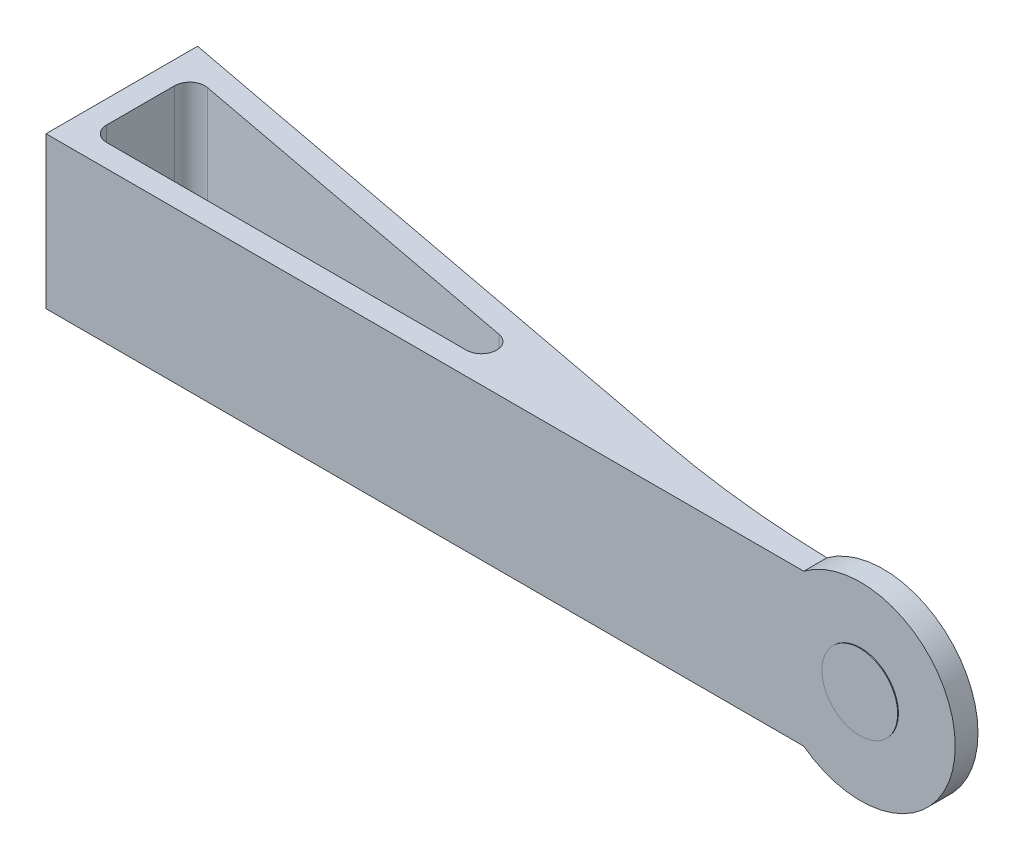
ISO-10303-21;
HEADER;
FILE_DESCRIPTION(('STEP AP214'),'2;1');
FILE_NAME('part.step','',(''),(''),'','','');
FILE_SCHEMA(('AUTOMOTIVE_DESIGN { 1 0 10303 214 1 1 1 1 }'));
ENDSEC;
DATA;
#1=APPLICATION_CONTEXT('core data for automotive mechanical design processes');
#2=APPLICATION_PROTOCOL_DEFINITION('international standard','automotive_design',2000,#1);
#3=PRODUCT_CONTEXT('',#1,'mechanical');
#4=PRODUCT('Part','Part','',(#3));
#5=PRODUCT_RELATED_PRODUCT_CATEGORY('part','',(#4));
#6=PRODUCT_DEFINITION_FORMATION('','',#4);
#7=PRODUCT_DEFINITION_CONTEXT('part definition',#1,'design');
#8=PRODUCT_DEFINITION('design','',#6,#7);
#9=PRODUCT_DEFINITION_SHAPE('','',#8);
#10=(LENGTH_UNIT() NAMED_UNIT(*) SI_UNIT(.MILLI.,.METRE.));
#11=(NAMED_UNIT(*) PLANE_ANGLE_UNIT() SI_UNIT($,.RADIAN.));
#12=(NAMED_UNIT(*) SI_UNIT($,.STERADIAN.) SOLID_ANGLE_UNIT());
#13=UNCERTAINTY_MEASURE_WITH_UNIT(LENGTH_MEASURE(1.E-05),#10,'distance_accuracy_value','');
#14=(GEOMETRIC_REPRESENTATION_CONTEXT(3) GLOBAL_UNCERTAINTY_ASSIGNED_CONTEXT((#13)) GLOBAL_UNIT_ASSIGNED_CONTEXT((#10,
#11,#12)) REPRESENTATION_CONTEXT('',''));
#15=CARTESIAN_POINT('',(0.,0.,0.));
#16=DIRECTION('',(0.,0.,1.));
#17=DIRECTION('',(1.,0.,0.));
#18=AXIS2_PLACEMENT_3D('',#15,#16,#17);
#19=CARTESIAN_POINT('',(0.,20.,2.09488880330588E-13));
#20=DIRECTION('',(0.,-1.,0.));
#21=DIRECTION('',(-1.,0.,0.));
#22=AXIS2_PLACEMENT_3D('',#19,#20,#21);
#23=PLANE('',#22);
#24=DIRECTION('',(1.,0.,0.));
#25=VECTOR('',#24,1.);
#26=CARTESIAN_POINT('',(115.,20.,2.0642726333272E-13));
#27=LINE('',#26,#25);
#28=CARTESIAN_POINT('',(0.,20.,2.09488880330588E-13));
#29=VERTEX_POINT('',#28);
#30=CARTESIAN_POINT('',(100.,20.,2.09688551004362E-13));
#31=VERTEX_POINT('',#30);
#32=EDGE_CURVE('E158',#29,#31,#27,.T.);
#33=ORIENTED_EDGE('',*,*,#32,.T.);
#34=DIRECTION('',(0.,0.,-1.));
#35=VECTOR('',#34,1.);
#36=CARTESIAN_POINT('',(100.,19.9999999999996,35.3553390593276));
#37=LINE('',#36,#35);
#38=CARTESIAN_POINT('',(100.,20.,-3.0544828167915));
#39=VERTEX_POINT('',#38);
#40=EDGE_CURVE('E305',#31,#39,#37,.T.);
#41=ORIENTED_EDGE('',*,*,#40,.T.);
#42=CARTESIAN_POINT('',(104.042508708734,20.0000000000016,-153.));
#43=DIRECTION('',(0.,-1.,0.));
#44=DIRECTION('',(-1.,0.,0.));
#45=AXIS2_PLACEMENT_3D('',#42,#43,#44);
#46=CIRCLE('',#45,150.);
#47=CARTESIAN_POINT('',(76.2014924950224,20.0000000000001,-5.60638475094001));
#48=VERTEX_POINT('',#47);
#49=EDGE_CURVE('E153',#39,#48,#46,.T.);
#50=ORIENTED_EDGE('',*,*,#49,.T.);
#51=DIRECTION('',(-0.982624101660399,0.,-0.185606774758075));
#52=VECTOR('',#51,1.);
#53=CARTESIAN_POINT('',(0.,20.0000000000002,-19.9999999999998));
#54=LINE('',#53,#52);
#55=CARTESIAN_POINT('',(0.,20.0000000000002,-19.9999999999998));
#56=VERTEX_POINT('',#55);
#57=EDGE_CURVE('E143',#48,#56,#54,.T.);
#58=ORIENTED_EDGE('',*,*,#57,.T.);
#59=DIRECTION('',(0.,0.,1.));
#60=VECTOR('',#59,1.);
#61=CARTESIAN_POINT('',(0.,20.,2.09488880330588E-13));
#62=LINE('',#61,#60);
#63=EDGE_CURVE('E146',#56,#29,#62,.T.);
#64=ORIENTED_EDGE('',*,*,#63,.T.);
#65=EDGE_LOOP('',(#33,#41,#50,#58,#64));
#66=FACE_BOUND('',#65,.T.);
#67=DIRECTION('',(-0.982624101660399,0.,-0.185606774758075));
#68=VECTOR('',#67,1.);
#69=CARTESIAN_POINT('',(3.,20.0000000000002,-16.380283855989));
#70=LINE('',#69,#68);
#71=CARTESIAN_POINT('',(52.8443063964799,20.0000000000001,-6.96524820332058));
#72=VERTEX_POINT('',#71);
#73=CARTESIAN_POINT('',(5.37121354951615,20.0000000000002,-15.9323879633026));
#74=VERTEX_POINT('',#73);
#75=EDGE_CURVE('E306',#72,#74,#70,.T.);
#76=ORIENTED_EDGE('',*,*,#75,.F.);
#77=CARTESIAN_POINT('',(52.4730928469638,20.0000000000001,-4.99999999999979));
#78=DIRECTION('',(0.,-1.,0.));
#79=DIRECTION('',(-1.,0.,0.));
#80=AXIS2_PLACEMENT_3D('',#77,#78,#79);
#81=CIRCLE('',#80,2.);
#82=CARTESIAN_POINT('',(52.4730928469638,20.,-2.99999999999979));
#83=VERTEX_POINT('',#82);
#84=EDGE_CURVE('E12',#72,#83,#81,.T.);
#85=ORIENTED_EDGE('',*,*,#84,.T.);
#86=DIRECTION('',(1.,0.,0.));
#87=VECTOR('',#86,1.);
#88=CARTESIAN_POINT('',(73.8367968846488,20.,-2.99999999999979));
#89=LINE('',#88,#87);
#90=CARTESIAN_POINT('',(5.,20.,-2.99999999999979));
#91=VERTEX_POINT('',#90);
#92=EDGE_CURVE('E185',#91,#83,#89,.T.);
#93=ORIENTED_EDGE('',*,*,#92,.F.);
#94=CARTESIAN_POINT('',(5.,20.0000000000001,-4.99999999999978));
#95=DIRECTION('',(0.,-1.,0.));
#96=DIRECTION('',(-1.,0.,0.));
#97=AXIS2_PLACEMENT_3D('',#94,#95,#96);
#98=CIRCLE('',#97,2.);
#99=CARTESIAN_POINT('',(3.,20.0000000000001,-4.99999999999978));
#100=VERTEX_POINT('',#99);
#101=EDGE_CURVE('E360',#91,#100,#98,.T.);
#102=ORIENTED_EDGE('',*,*,#101,.T.);
#103=DIRECTION('',(0.,0.,1.));
#104=VECTOR('',#103,1.);
#105=CARTESIAN_POINT('',(3.,20.,-2.99999999999979));
#106=LINE('',#105,#104);
#107=CARTESIAN_POINT('',(3.,20.0000000000001,-13.9671397599818));
#108=VERTEX_POINT('',#107);
#109=EDGE_CURVE('E307',#108,#100,#106,.T.);
#110=ORIENTED_EDGE('',*,*,#109,.F.);
#111=CARTESIAN_POINT('',(5.,20.0000000000001,-13.9671397599818));
#112=DIRECTION('',(0.,-1.,0.));
#113=DIRECTION('',(-1.,0.,0.));
#114=AXIS2_PLACEMENT_3D('',#111,#112,#113);
#115=CIRCLE('',#114,2.);
#116=EDGE_CURVE('E62',#108,#74,#115,.T.);
#117=ORIENTED_EDGE('',*,*,#116,.T.);
#118=EDGE_LOOP('',(#76,#85,#93,#102,#110,#117));
#119=FACE_BOUND('',#118,.T.);
#120=ADVANCED_FACE('F47',(#66,#119),#23,.F.);
#121=CARTESIAN_POINT('',(0.,0.,0.));
#122=DIRECTION('',(0.,-1.,0.));
#123=DIRECTION('',(-1.,0.,0.));
#124=AXIS2_PLACEMENT_3D('',#121,#122,#123);
#125=PLANE('',#124);
#126=DIRECTION('',(0.,0.,-1.));
#127=VECTOR('',#126,1.);
#128=CARTESIAN_POINT('',(100.,-3.7032751966234E-13,35.3553390593274));
#129=LINE('',#128,#127);
#130=CARTESIAN_POINT('',(100.,0.,0.));
#131=VERTEX_POINT('',#130);
#132=CARTESIAN_POINT('',(100.,0.,-3.05448281679171));
#133=VERTEX_POINT('',#132);
#134=EDGE_CURVE('E296',#131,#133,#129,.T.);
#135=ORIENTED_EDGE('',*,*,#134,.F.);
#136=DIRECTION('',(1.,0.,0.));
#137=VECTOR('',#136,1.);
#138=CARTESIAN_POINT('',(115.,0.,0.));
#139=LINE('',#138,#137);
#140=CARTESIAN_POINT('',(0.,0.,0.));
#141=VERTEX_POINT('',#140);
#142=EDGE_CURVE('E178',#141,#131,#139,.T.);
#143=ORIENTED_EDGE('',*,*,#142,.F.);
#144=DIRECTION('',(0.,0.,1.));
#145=VECTOR('',#144,1.);
#146=CARTESIAN_POINT('',(0.,0.,0.));
#147=LINE('',#146,#145);
#148=CARTESIAN_POINT('',(0.,2.09488880330588E-13,-20.));
#149=VERTEX_POINT('',#148);
#150=EDGE_CURVE('E184',#149,#141,#147,.T.);
#151=ORIENTED_EDGE('',*,*,#150,.F.);
#152=DIRECTION('',(-0.982624101660399,0.,-0.185606774758075));
#153=VECTOR('',#152,1.);
#154=CARTESIAN_POINT('',(0.,2.09488880330588E-13,-20.));
#155=LINE('',#154,#153);
#156=CARTESIAN_POINT('',(76.2014924950224,0.,-5.60638475094022));
#157=VERTEX_POINT('',#156);
#158=EDGE_CURVE('E162',#157,#149,#155,.T.);
#159=ORIENTED_EDGE('',*,*,#158,.F.);
#160=CARTESIAN_POINT('',(104.042508708734,1.602589934529E-12,-153.));
#161=DIRECTION('',(0.,-1.,0.));
#162=DIRECTION('',(-1.,0.,0.));
#163=AXIS2_PLACEMENT_3D('',#160,#161,#162);
#164=CIRCLE('',#163,150.);
#165=EDGE_CURVE('E201',#157,#133,#164,.F.);
#166=ORIENTED_EDGE('',*,*,#165,.T.);
#167=EDGE_LOOP('',(#135,#143,#151,#159,#166));
#168=FACE_BOUND('',#167,.T.);
#169=DIRECTION('',(0.,0.,1.));
#170=VECTOR('',#169,1.);
#171=CARTESIAN_POINT('',(3.,0.,-2.99999999999999));
#172=LINE('',#171,#170);
#173=CARTESIAN_POINT('',(3.,1.46298023486974E-13,-13.967139759982));
#174=VERTEX_POINT('',#173);
#175=CARTESIAN_POINT('',(3.,0.,-4.99999999999999));
#176=VERTEX_POINT('',#175);
#177=EDGE_CURVE('E318',#174,#176,#172,.T.);
#178=ORIENTED_EDGE('',*,*,#177,.T.);
#179=CARTESIAN_POINT('',(5.,0.,-4.99999999999999));
#180=DIRECTION('',(0.,-1.,0.));
#181=DIRECTION('',(-1.,0.,0.));
#182=AXIS2_PLACEMENT_3D('',#179,#180,#181);
#183=CIRCLE('',#182,2.);
#184=CARTESIAN_POINT('',(5.,0.,-2.99999999999999));
#185=VERTEX_POINT('',#184);
#186=EDGE_CURVE('E358',#176,#185,#183,.F.);
#187=ORIENTED_EDGE('',*,*,#186,.T.);
#188=DIRECTION('',(1.,0.,0.));
#189=VECTOR('',#188,1.);
#190=CARTESIAN_POINT('',(73.8367968846488,0.,-3.));
#191=LINE('',#190,#189);
#192=CARTESIAN_POINT('',(52.4730928469638,0.,-3.));
#193=VERTEX_POINT('',#192);
#194=EDGE_CURVE('E309',#185,#193,#191,.T.);
#195=ORIENTED_EDGE('',*,*,#194,.T.);
#196=CARTESIAN_POINT('',(52.4730928469638,0.,-5.));
#197=DIRECTION('',(0.,-1.,0.));
#198=DIRECTION('',(-1.,0.,0.));
#199=AXIS2_PLACEMENT_3D('',#196,#197,#198);
#200=CIRCLE('',#199,2.);
#201=CARTESIAN_POINT('',(52.8443063964799,0.,-6.96524820332079));
#202=VERTEX_POINT('',#201);
#203=EDGE_CURVE('E59',#193,#202,#200,.F.);
#204=ORIENTED_EDGE('',*,*,#203,.T.);
#205=DIRECTION('',(-0.982624101660399,0.,-0.185606774758075));
#206=VECTOR('',#205,1.);
#207=CARTESIAN_POINT('',(3.,1.71574366224419E-13,-16.3802838559892));
#208=LINE('',#207,#206);
#209=CARTESIAN_POINT('',(5.37121354951615,1.66882905771242E-13,-15.9323879633028));
#210=VERTEX_POINT('',#209);
#211=EDGE_CURVE('E304',#202,#210,#208,.T.);
#212=ORIENTED_EDGE('',*,*,#211,.T.);
#213=CARTESIAN_POINT('',(5.,1.46298023486974E-13,-13.967139759982));
#214=DIRECTION('',(0.,-1.,0.));
#215=DIRECTION('',(-1.,0.,0.));
#216=AXIS2_PLACEMENT_3D('',#213,#214,#215);
#217=CIRCLE('',#216,2.);
#218=EDGE_CURVE('E365',#210,#174,#217,.F.);
#219=ORIENTED_EDGE('',*,*,#218,.T.);
#220=EDGE_LOOP('',(#178,#187,#195,#204,#212,#219));
#221=FACE_BOUND('',#220,.T.);
#222=ADVANCED_FACE('F258',(#168,#221),#125,.T.);
#223=CARTESIAN_POINT('',(115.,20.,2.0642726333272E-13));
#224=DIRECTION('',(0.,0.,-1.));
#225=DIRECTION('',(-1.,0.,0.));
#226=AXIS2_PLACEMENT_3D('',#223,#224,#225);
#227=PLANE('',#226);
#228=CARTESIAN_POINT('',(107.5,10.,1.0127499321334E-13));
#229=DIRECTION('',(0.,0.,-1.));
#230=DIRECTION('',(-1.,0.,0.));
#231=AXIS2_PLACEMENT_3D('',#228,#229,#230);
#232=CIRCLE('',#231,5.);
#233=CARTESIAN_POINT('',(102.5,10.,1.01408106995856E-13));
#234=VERTEX_POINT('',#233);
#235=EDGE_CURVE('E287',#234,#234,#232,.T.);
#236=ORIENTED_EDGE('',*,*,#235,.T.);
#237=EDGE_LOOP('',(#236));
#238=FACE_BOUND('',#237,.T.);
#239=ORIENTED_EDGE('',*,*,#142,.T.);
#240=CARTESIAN_POINT('',(107.5,10.,1.04744440165294E-13));
#241=DIRECTION('',(0.,0.,-1.));
#242=DIRECTION('',(-1.,0.,0.));
#243=AXIS2_PLACEMENT_3D('',#240,#241,#242);
#244=CIRCLE('',#243,12.5);
#245=EDGE_CURVE('E277',#131,#31,#244,.F.);
#246=ORIENTED_EDGE('',*,*,#245,.T.);
#247=ORIENTED_EDGE('',*,*,#32,.F.);
#248=DIRECTION('',(0.,-1.,0.));
#249=VECTOR('',#248,1.);
#250=CARTESIAN_POINT('',(0.,20.,2.09488880330588E-13));
#251=LINE('',#250,#249);
#252=EDGE_CURVE('E170',#29,#141,#251,.T.);
#253=ORIENTED_EDGE('',*,*,#252,.T.);
#254=EDGE_LOOP('',(#239,#246,#247,#253));
#255=FACE_BOUND('',#254,.T.);
#256=ADVANCED_FACE('F217',(#238,#255),#227,.F.);
#257=CARTESIAN_POINT('',(90.,20.,-2.9999999999998));
#258=DIRECTION('',(0.,0.,1.));
#259=DIRECTION('',(1.,0.,0.));
#260=AXIS2_PLACEMENT_3D('',#257,#258,#259);
#261=PLANE('',#260);
#262=CARTESIAN_POINT('',(107.5,10.,-2.99999999999991));
#263=DIRECTION('',(0.,0.,-1.));
#264=DIRECTION('',(-1.,0.,0.));
#265=AXIS2_PLACEMENT_3D('',#262,#263,#264);
#266=CIRCLE('',#265,12.5);
#267=CARTESIAN_POINT('',(104.042508708734,22.0123167611755,-2.99999999999978));
#268=VERTEX_POINT('',#267);
#269=CARTESIAN_POINT('',(104.042508708734,-2.01231676117544,-3.00000000000003));
#270=VERTEX_POINT('',#269);
#271=EDGE_CURVE('E275',#268,#270,#266,.T.);
#272=ORIENTED_EDGE('',*,*,#271,.T.);
#273=DIRECTION('',(0.,-1.,0.));
#274=VECTOR('',#273,1.);
#275=CARTESIAN_POINT('',(104.042508708734,20.,-2.99999999999979));
#276=LINE('',#275,#274);
#277=CARTESIAN_POINT('',(104.042508708734,6.38810936339194,-2.99999999999994));
#278=VERTEX_POINT('',#277);
#279=EDGE_CURVE('E191',#270,#278,#276,.F.);
#280=ORIENTED_EDGE('',*,*,#279,.T.);
#281=CARTESIAN_POINT('',(107.5,10.,-2.99999999999991));
#282=DIRECTION('',(0.,0.,-1.));
#283=DIRECTION('',(-1.,0.,0.));
#284=AXIS2_PLACEMENT_3D('',#281,#282,#283);
#285=CIRCLE('',#284,5.);
#286=CARTESIAN_POINT('',(104.042508708734,13.6118906366081,-2.99999999999987));
#287=VERTEX_POINT('',#286);
#288=EDGE_CURVE('E283',#287,#278,#285,.T.);
#289=ORIENTED_EDGE('',*,*,#288,.F.);
#290=DIRECTION('',(0.,-1.,0.));
#291=VECTOR('',#290,1.);
#292=CARTESIAN_POINT('',(104.042508708734,20.,-2.99999999999979));
#293=LINE('',#292,#291);
#294=EDGE_CURVE('E188',#287,#268,#293,.F.);
#295=ORIENTED_EDGE('',*,*,#294,.T.);
#296=EDGE_LOOP('',(#272,#280,#289,#295));
#297=FACE_BOUND('',#296,.T.);
#298=ADVANCED_FACE('F261',(#297),#261,.F.);
#299=CARTESIAN_POINT('',(0.,20.0000000000002,-19.9999999999998));
#300=DIRECTION('',(-0.185606774758075,0.,0.982624101660398));
#301=DIRECTION('',(0.982624101660398,0.,0.185606774758075));
#302=AXIS2_PLACEMENT_3D('',#299,#300,#301);
#303=PLANE('',#302);
#304=ORIENTED_EDGE('',*,*,#57,.F.);
#305=DIRECTION('',(0.,-1.,0.));
#306=VECTOR('',#305,1.);
#307=CARTESIAN_POINT('',(76.2014924950224,0.,-5.60638475094023));
#308=LINE('',#307,#306);
#309=EDGE_CURVE('E168',#48,#157,#308,.T.);
#310=ORIENTED_EDGE('',*,*,#309,.T.);
#311=ORIENTED_EDGE('',*,*,#158,.T.);
#312=DIRECTION('',(0.,-1.,0.));
#313=VECTOR('',#312,1.);
#314=CARTESIAN_POINT('',(0.,20.0000000000002,-19.9999999999998));
#315=LINE('',#314,#313);
#316=EDGE_CURVE('E160',#56,#149,#315,.T.);
#317=ORIENTED_EDGE('',*,*,#316,.F.);
#318=EDGE_LOOP('',(#304,#310,#311,#317));
#319=FACE_BOUND('',#318,.T.);
#320=ADVANCED_FACE('F156',(#319),#303,.F.);
#321=CARTESIAN_POINT('',(0.,20.,2.09488880330588E-13));
#322=DIRECTION('',(1.,0.,0.));
#323=DIRECTION('',(0.,-1.,0.));
#324=AXIS2_PLACEMENT_3D('',#321,#322,#323);
#325=PLANE('',#324);
#326=ORIENTED_EDGE('',*,*,#150,.T.);
#327=ORIENTED_EDGE('',*,*,#252,.F.);
#328=ORIENTED_EDGE('',*,*,#63,.F.);
#329=ORIENTED_EDGE('',*,*,#316,.T.);
#330=EDGE_LOOP('',(#326,#327,#328,#329));
#331=FACE_BOUND('',#330,.T.);
#332=ADVANCED_FACE('F169',(#331),#325,.F.);
#333=CARTESIAN_POINT('',(3.,20.0000000000002,-16.380283855989));
#334=DIRECTION('',(-0.185606774758075,0.,0.982624101660398));
#335=DIRECTION('',(0.982624101660398,0.,0.185606774758075));
#336=AXIS2_PLACEMENT_3D('',#333,#334,#335);
#337=PLANE('',#336);
#338=ORIENTED_EDGE('',*,*,#75,.T.);
#339=DIRECTION('',(0.,-1.,0.));
#340=VECTOR('',#339,1.);
#341=CARTESIAN_POINT('',(5.37121354951615,1.66882905771242E-13,-15.9323879633028));
#342=LINE('',#341,#340);
#343=EDGE_CURVE('E354',#74,#210,#342,.T.);
#344=ORIENTED_EDGE('',*,*,#343,.T.);
#345=ORIENTED_EDGE('',*,*,#211,.F.);
#346=DIRECTION('',(0.,-1.,0.));
#347=VECTOR('',#346,1.);
#348=CARTESIAN_POINT('',(52.8443063964799,20.0000000000001,-6.96524820332059));
#349=LINE('',#348,#347);
#350=EDGE_CURVE('E74',#202,#72,#349,.F.);
#351=ORIENTED_EDGE('',*,*,#350,.T.);
#352=EDGE_LOOP('',(#338,#344,#345,#351));
#353=FACE_BOUND('',#352,.T.);
#354=ADVANCED_FACE('F249',(#353),#337,.T.);
#355=CARTESIAN_POINT('',(3.,20.,-2.99999999999979));
#356=DIRECTION('',(1.,0.,0.));
#357=DIRECTION('',(0.,0.,-1.));
#358=AXIS2_PLACEMENT_3D('',#355,#356,#357);
#359=PLANE('',#358);
#360=ORIENTED_EDGE('',*,*,#109,.T.);
#361=DIRECTION('',(0.,-1.,0.));
#362=VECTOR('',#361,1.);
#363=CARTESIAN_POINT('',(3.,0.,-4.99999999999999));
#364=LINE('',#363,#362);
#365=EDGE_CURVE('E339',#100,#176,#364,.T.);
#366=ORIENTED_EDGE('',*,*,#365,.T.);
#367=ORIENTED_EDGE('',*,*,#177,.F.);
#368=DIRECTION('',(0.,-1.,0.));
#369=VECTOR('',#368,1.);
#370=CARTESIAN_POINT('',(3.,20.0000000000001,-13.9671397599818));
#371=LINE('',#370,#369);
#372=EDGE_CURVE('E340',#174,#108,#371,.F.);
#373=ORIENTED_EDGE('',*,*,#372,.T.);
#374=EDGE_LOOP('',(#360,#366,#367,#373));
#375=FACE_BOUND('',#374,.T.);
#376=ADVANCED_FACE('F246',(#375),#359,.T.);
#377=CARTESIAN_POINT('',(73.8367968846488,20.,-2.99999999999979));
#378=DIRECTION('',(0.,0.,-1.));
#379=DIRECTION('',(-1.,0.,0.));
#380=AXIS2_PLACEMENT_3D('',#377,#378,#379);
#381=PLANE('',#380);
#382=ORIENTED_EDGE('',*,*,#194,.F.);
#383=DIRECTION('',(0.,-1.,0.));
#384=VECTOR('',#383,1.);
#385=CARTESIAN_POINT('',(5.,20.,-2.99999999999979));
#386=LINE('',#385,#384);
#387=EDGE_CURVE('E350',#185,#91,#386,.F.);
#388=ORIENTED_EDGE('',*,*,#387,.T.);
#389=ORIENTED_EDGE('',*,*,#92,.T.);
#390=DIRECTION('',(0.,-1.,0.));
#391=VECTOR('',#390,1.);
#392=CARTESIAN_POINT('',(52.4730928469638,0.,-3.));
#393=LINE('',#392,#391);
#394=EDGE_CURVE('E341',#83,#193,#393,.T.);
#395=ORIENTED_EDGE('',*,*,#394,.T.);
#396=EDGE_LOOP('',(#382,#388,#389,#395));
#397=FACE_BOUND('',#396,.T.);
#398=ADVANCED_FACE('F241',(#397),#381,.T.);
#399=CARTESIAN_POINT('',(107.5,9.99999999999963,35.3553390593275));
#400=DIRECTION('',(0.,0.,-1.));
#401=DIRECTION('',(-1.,0.,0.));
#402=AXIS2_PLACEMENT_3D('',#399,#400,#401);
#403=CYLINDRICAL_SURFACE('',#402,12.5);
#404=ORIENTED_EDGE('',*,*,#40,.F.);
#405=ORIENTED_EDGE('',*,*,#245,.F.);
#406=ORIENTED_EDGE('',*,*,#134,.T.);
#407=CARTESIAN_POINT('',(100.,0.,-3.05448281679171));
#408=CARTESIAN_POINT('',(100.151968135278,-0.11397652975066,-3.05038557264711));
#409=CARTESIAN_POINT('',(100.306518577581,-0.224475455501621,-3.04645038405748));
#410=CARTESIAN_POINT('',(100.620498684097,-0.438320987546193,-3.03895671694697));
#411=CARTESIAN_POINT('',(100.779928326436,-0.541667625898797,-3.03539823673751));
#412=CARTESIAN_POINT('',(101.262374354991,-0.838998925203161,-3.02542326588313));
#413=CARTESIAN_POINT('',(101.592128734633,-1.02220853016424,-3.01963622101577));
#414=CARTESIAN_POINT('',(102.266867759331,-1.35809622375899,-3.01013067717489));
#415=CARTESIAN_POINT('',(102.611852450328,-1.51077422029208,-3.00641218444123));
#416=CARTESIAN_POINT('',(103.139984614211,-1.71650098617106,-3.00261052264653));
#417=CARTESIAN_POINT('',(103.318579288603,-1.78141832177643,-3.00163902788058));
#418=CARTESIAN_POINT('',(103.678544789357,-1.90304867616057,-3.00033349846672));
#419=CARTESIAN_POINT('',(103.859915638653,-1.95976162712094,-2.99999946908789));
#420=CARTESIAN_POINT('',(104.042508708734,-2.01231676117544,-3.00000000000003));
#421=B_SPLINE_CURVE_WITH_KNOTS('',3,(#407,#408,#409,#410,#411,#412,#413,#414,#415,#416,#417,
#418,#419,#420),.UNSPECIFIED.,.F.,.F.,(4,2,2,2,2,2,4),(0.,0.569916018748914,1.13982948277419,
2.27001604917608,3.40020602480786,3.9701207496711,4.54004018524756),.UNSPECIFIED.);
#422=EDGE_CURVE('E225',#133,#270,#421,.T.);
#423=ORIENTED_EDGE('',*,*,#422,.T.);
#424=ORIENTED_EDGE('',*,*,#271,.F.);
#425=CARTESIAN_POINT('',(104.042508708734,22.0123167611755,-2.99999999999977));
#426=CARTESIAN_POINT('',(103.859915638653,21.959761627121,-2.99999946908766));
#427=CARTESIAN_POINT('',(103.678544789357,21.9030486761606,-3.0003334984665));
#428=CARTESIAN_POINT('',(103.318579288603,21.7814183217765,-3.00163902788035));
#429=CARTESIAN_POINT('',(103.139984614211,21.7165009861711,-3.00261052264628));
#430=CARTESIAN_POINT('',(102.611852450328,21.5107742202922,-3.00641218444096));
#431=CARTESIAN_POINT('',(102.266867759331,21.3580962237591,-3.01013067717464));
#432=CARTESIAN_POINT('',(101.592128734633,21.0222085301643,-3.01963622101553));
#433=CARTESIAN_POINT('',(101.262374354991,20.8389989252032,-3.02542326588289));
#434=CARTESIAN_POINT('',(100.779928326436,20.5416676258989,-3.03539823673729));
#435=CARTESIAN_POINT('',(100.620498684097,20.4383209875463,-3.03895671694674));
#436=CARTESIAN_POINT('',(100.306518577581,20.2244754555017,-3.04645038405726));
#437=CARTESIAN_POINT('',(100.151968135278,20.1139765297507,-3.0503855726469));
#438=CARTESIAN_POINT('',(100.,20.,-3.0544828167915));
#439=B_SPLINE_CURVE_WITH_KNOTS('',3,(#425,#426,#427,#428,#429,#430,#431,#432,#433,#434,#435,
#436,#437,#438),.UNSPECIFIED.,.F.,.F.,(4,2,2,2,2,2,4),(0.,0.569919435576493,1.1398341604397,
2.27002413607147,3.40021070247337,3.97012416649863,4.54004018524755),.UNSPECIFIED.);
#440=EDGE_CURVE('E229',#268,#39,#439,.T.);
#441=ORIENTED_EDGE('',*,*,#440,.T.);
#442=EDGE_LOOP('',(#404,#405,#406,#423,#424,#441));
#443=FACE_BOUND('',#442,.T.);
#444=ADVANCED_FACE('F236',(#443),#403,.T.);
#445=CARTESIAN_POINT('',(0.,0.,-3.10000000000001));
#446=DIRECTION('',(0.,0.,-1.));
#447=DIRECTION('',(-1.,0.,0.));
#448=AXIS2_PLACEMENT_3D('',#445,#446,#447);
#449=PLANE('',#448);
#450=CARTESIAN_POINT('',(107.5,10.,-3.09999999999991));
#451=DIRECTION('',(0.,0.,-1.));
#452=DIRECTION('',(-1.,0.,0.));
#453=AXIS2_PLACEMENT_3D('',#450,#451,#452);
#454=CIRCLE('',#453,5.);
#455=CARTESIAN_POINT('',(102.5,10.,-3.09999999999991));
#456=VERTEX_POINT('',#455);
#457=EDGE_CURVE('E512',#456,#456,#454,.T.);
#458=ORIENTED_EDGE('',*,*,#457,.T.);
#459=EDGE_LOOP('',(#458));
#460=FACE_BOUND('',#459,.T.);
#461=ADVANCED_FACE('F239',(#460),#449,.T.);
#462=CARTESIAN_POINT('',(107.5,9.99999999999985,14.3421356237311));
#463=DIRECTION('',(0.,0.,-1.));
#464=DIRECTION('',(-1.,0.,0.));
#465=AXIS2_PLACEMENT_3D('',#462,#463,#464);
#466=CYLINDRICAL_SURFACE('',#465,5.);
#467=ORIENTED_EDGE('',*,*,#457,.F.);
#468=EDGE_LOOP('',(#467));
#469=FACE_BOUND('',#468,.T.);
#470=ORIENTED_EDGE('',*,*,#288,.T.);
#471=CARTESIAN_POINT('',(104.042508708734,6.38810936339194,-2.99999999999994));
#472=CARTESIAN_POINT('',(103.940910450218,6.48534360920785,-2.99999998028635));
#473=CARTESIAN_POINT('',(103.843436955738,6.58688358012065,-3.00010325307239));
#474=CARTESIAN_POINT('',(103.657387721942,6.79780316281358,-3.00046554935474));
#475=CARTESIAN_POINT('',(103.568811549028,6.90718239211352,-3.00072456525684));
#476=CARTESIAN_POINT('',(103.401260026048,7.13293090715244,-3.00134728228624));
#477=CARTESIAN_POINT('',(103.322277297348,7.2492947165622,-3.0017109022247));
#478=CARTESIAN_POINT('',(103.174391211937,7.48825779590151,-3.0024938809909));
#479=CARTESIAN_POINT('',(103.105487734332,7.61085699101861,-3.00291323914999));
#480=CARTESIAN_POINT('',(102.978230419263,7.86145949114705,-3.00376216635444));
#481=CARTESIAN_POINT('',(102.919879727244,7.98946439344789,-3.0041917384012));
#482=CARTESIAN_POINT('',(102.814148101661,8.24998249204699,-3.00502032310454));
#483=CARTESIAN_POINT('',(102.766771229609,8.38249733677122,-3.00541932441015));
#484=CARTESIAN_POINT('',(102.683373742852,8.65097793582861,-3.00615182007978));
#485=CARTESIAN_POINT('',(102.647347222,8.7869418555069,-3.00648534847841));
#486=CARTESIAN_POINT('',(102.586861688928,9.06147165837428,-3.00706013921762));
#487=CARTESIAN_POINT('',(102.562406947603,9.20003848265244,-3.00730136748594));
#488=CARTESIAN_POINT('',(102.525264969173,9.47869244073982,-3.00767247295866));
#489=CARTESIAN_POINT('',(102.512573730976,9.61877904121777,-3.00780238802262));
#490=CARTESIAN_POINT('',(102.499032118623,9.89957555091529,-3.00794112284539));
#491=CARTESIAN_POINT('',(102.498186133809,10.0402856718656,-3.00794989771485));
#492=CARTESIAN_POINT('',(102.508351090668,10.3212413057167,-3.00784558524764));
#493=CARTESIAN_POINT('',(102.519359036971,10.4614869270114,-3.00773252869657));
#494=CARTESIAN_POINT('',(102.553154902638,10.7406031376349,-3.00739314794991));
#495=CARTESIAN_POINT('',(102.575947106004,10.8794732081775,-3.00716678256344));
#496=CARTESIAN_POINT('',(102.633142822917,11.1547539135389,-3.00661846568878));
#497=CARTESIAN_POINT('',(102.667542517168,11.2911653418099,-3.00629654564581));
#498=CARTESIAN_POINT('',(102.74772422165,11.5606565876063,-3.00558297070021));
#499=CARTESIAN_POINT('',(102.793510673585,11.6937350826843,-3.00519128860204));
#500=CARTESIAN_POINT('',(102.896108479123,11.9554851759721,-3.00437208523116));
#501=CARTESIAN_POINT('',(102.95291294496,12.0841594685936,-3.00394458644313));
#502=CARTESIAN_POINT('',(103.077151588735,12.336276906253,-3.00309354836888));
#503=CARTESIAN_POINT('',(103.144588614437,12.4597186385601,-3.00267001017573));
#504=CARTESIAN_POINT('',(103.331144804831,12.7693599965106,-3.0016434830993));
#505=CARTESIAN_POINT('',(103.457782413293,12.951132427014,-3.00107617659077));
#506=CARTESIAN_POINT('',(103.664732039959,13.2098207824801,-3.00045988584984));
#507=CARTESIAN_POINT('',(103.736533423326,13.2937084160777,-3.00029357567738));
#508=CARTESIAN_POINT('',(103.885539659381,13.4565652374761,-3.00006362029244));
#509=CARTESIAN_POINT('',(103.962745419638,13.5355335949426,-2.99999999236701));
#510=CARTESIAN_POINT('',(104.042508708734,13.6118906366081,-2.99999999999986));
#511=B_SPLINE_CURVE_WITH_KNOTS('',3,(#471,#472,#473,#474,#475,#476,#477,#478,#479,#480,#481,
#482,#483,#484,#485,#486,#487,#488,#489,#490,#491,#492,#493,#494,#495,#496,#497,#498,#499,#500,
#501,#502,#503,#504,#505,#506,#507,#508,#509,#510),.UNSPECIFIED.,.F.,.F.,(4,2,2,2,2,2,2,2,2,2,2,
2,2,2,2,2,2,2,2,4),(0.,0.421760110879023,0.843499657923488,1.26491274916004,1.68632078545452,
2.10785422364916,2.52954342684376,2.9510128405499,3.37263768844202,3.7941190774154,
4.21575664513947,4.63728769421986,5.05897209286168,5.48051787677157,5.90222835425589,
6.32367604977991,6.74523681584243,7.40758899194544,7.7386494208493,8.06976557952776),.UNSPECIFIED.);
#512=EDGE_CURVE('E198',#278,#287,#511,.T.);
#513=ORIENTED_EDGE('',*,*,#512,.T.);
#514=EDGE_LOOP('',(#470,#513));
#515=FACE_BOUND('',#514,.T.);
#516=ADVANCED_FACE('F288',(#469,#515),#466,.T.);
#517=CARTESIAN_POINT('',(107.5,10.,0.100000000000102));
#518=DIRECTION('',(0.,0.,-1.));
#519=DIRECTION('',(-1.,0.,0.));
#520=AXIS2_PLACEMENT_3D('',#517,#518,#519);
#521=CIRCLE('',#520,5.);
#522=CARTESIAN_POINT('',(102.5,10.,0.100000000000103));
#523=VERTEX_POINT('',#522);
#524=EDGE_CURVE('E292',#523,#523,#521,.F.);
#525=ORIENTED_EDGE('',*,*,#524,.F.);
#526=EDGE_LOOP('',(#525));
#527=FACE_BOUND('',#526,.T.);
#528=ORIENTED_EDGE('',*,*,#235,.F.);
#529=EDGE_LOOP('',(#528));
#530=FACE_BOUND('',#529,.T.);
#531=ADVANCED_FACE('F210',(#527,#530),#466,.T.);
#532=CARTESIAN_POINT('',(115.,20.,0.100000000000206));
#533=DIRECTION('',(0.,0.,-1.));
#534=DIRECTION('',(-1.,0.,0.));
#535=AXIS2_PLACEMENT_3D('',#532,#533,#534);
#536=PLANE('',#535);
#537=ORIENTED_EDGE('',*,*,#524,.T.);
#538=EDGE_LOOP('',(#537));
#539=FACE_BOUND('',#538,.T.);
#540=ADVANCED_FACE('F220',(#539),#536,.F.);
#541=CARTESIAN_POINT('',(104.042508708734,20.0000000000016,-153.));
#542=DIRECTION('',(0.,1.,0.));
#543=DIRECTION('',(1.,0.,0.));
#544=AXIS2_PLACEMENT_3D('',#541,#542,#543);
#545=CYLINDRICAL_SURFACE('',#544,150.);
#546=ORIENTED_EDGE('',*,*,#512,.F.);
#547=ORIENTED_EDGE('',*,*,#279,.F.);
#548=ORIENTED_EDGE('',*,*,#422,.F.);
#549=ORIENTED_EDGE('',*,*,#165,.F.);
#550=ORIENTED_EDGE('',*,*,#309,.F.);
#551=ORIENTED_EDGE('',*,*,#49,.F.);
#552=ORIENTED_EDGE('',*,*,#440,.F.);
#553=ORIENTED_EDGE('',*,*,#294,.F.);
#554=EDGE_LOOP('',(#546,#547,#548,#549,#550,#551,#552,#553));
#555=FACE_BOUND('',#554,.T.);
#556=ADVANCED_FACE('F213',(#555),#545,.F.);
#557=CARTESIAN_POINT('',(5.,20.0000000000001,-4.99999999999978));
#558=DIRECTION('',(0.,1.,0.));
#559=DIRECTION('',(1.,0.,0.));
#560=AXIS2_PLACEMENT_3D('',#557,#558,#559);
#561=CYLINDRICAL_SURFACE('',#560,2.);
#562=ORIENTED_EDGE('',*,*,#101,.F.);
#563=ORIENTED_EDGE('',*,*,#387,.F.);
#564=ORIENTED_EDGE('',*,*,#186,.F.);
#565=ORIENTED_EDGE('',*,*,#365,.F.);
#566=EDGE_LOOP('',(#562,#563,#564,#565));
#567=FACE_BOUND('',#566,.T.);
#568=ADVANCED_FACE('F218',(#567),#561,.F.);
#569=CARTESIAN_POINT('',(5.,20.0000000000001,-13.9671397599818));
#570=DIRECTION('',(0.,1.,0.));
#571=DIRECTION('',(1.,0.,0.));
#572=AXIS2_PLACEMENT_3D('',#569,#570,#571);
#573=CYLINDRICAL_SURFACE('',#572,2.);
#574=ORIENTED_EDGE('',*,*,#116,.F.);
#575=ORIENTED_EDGE('',*,*,#372,.F.);
#576=ORIENTED_EDGE('',*,*,#218,.F.);
#577=ORIENTED_EDGE('',*,*,#343,.F.);
#578=EDGE_LOOP('',(#574,#575,#576,#577));
#579=FACE_BOUND('',#578,.T.);
#580=ADVANCED_FACE('F382',(#579),#573,.F.);
#581=CARTESIAN_POINT('',(52.4730928469638,20.0000000000001,-4.99999999999979));
#582=DIRECTION('',(0.,1.,0.));
#583=DIRECTION('',(1.,0.,0.));
#584=AXIS2_PLACEMENT_3D('',#581,#582,#583);
#585=CYLINDRICAL_SURFACE('',#584,2.);
#586=ORIENTED_EDGE('',*,*,#84,.F.);
#587=ORIENTED_EDGE('',*,*,#350,.F.);
#588=ORIENTED_EDGE('',*,*,#203,.F.);
#589=ORIENTED_EDGE('',*,*,#394,.F.);
#590=EDGE_LOOP('',(#586,#587,#588,#589));
#591=FACE_BOUND('',#590,.T.);
#592=ADVANCED_FACE('F51',(#591),#585,.F.);
#593=CLOSED_SHELL('',(#120,#222,#256,#298,#320,#332,#354,#376,#398,#444,#461,#516,#531,#540,
#556,#568,#580,#592));
#594=MANIFOLD_SOLID_BREP('B2',#593);
#595=ADVANCED_BREP_SHAPE_REPRESENTATION('',(#18,#594),#14);
#596=SHAPE_DEFINITION_REPRESENTATION(#9,#595);
ENDSEC;
END-ISO-10303-21;
